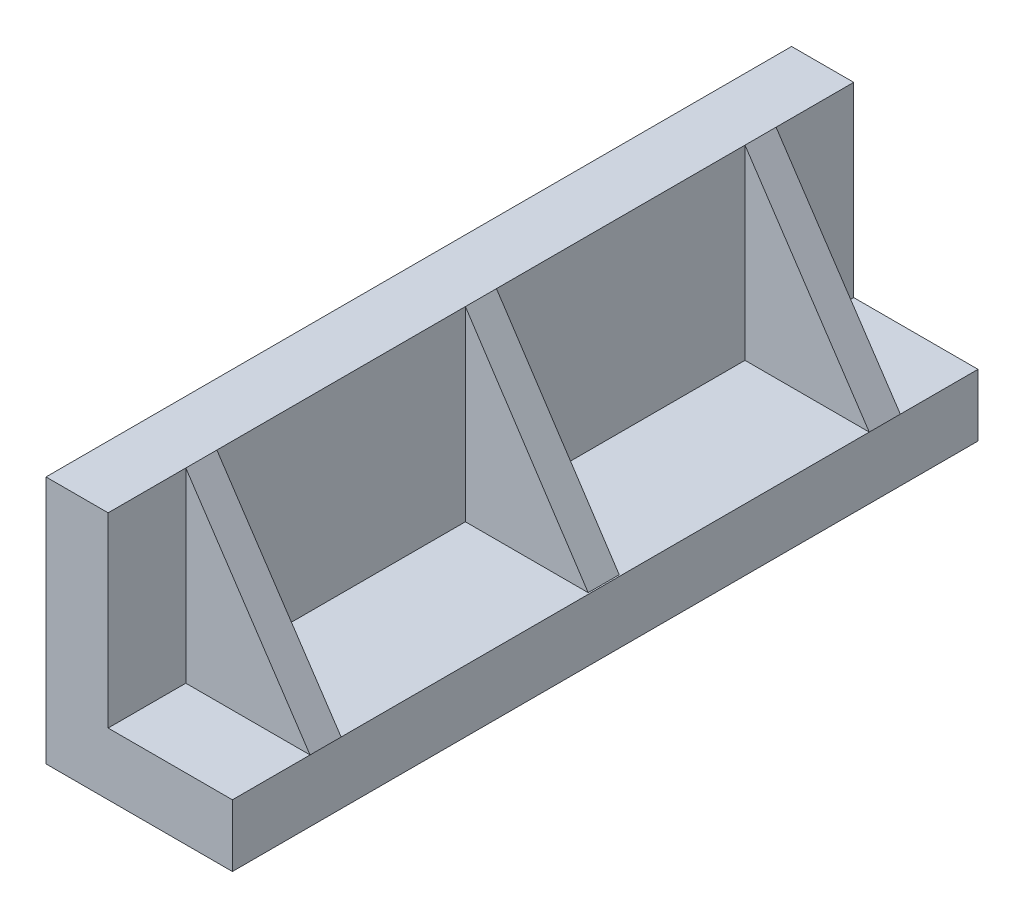
ISO-10303-21;
HEADER;
FILE_DESCRIPTION(('STEP AP214'),'2;1');
FILE_NAME('part.step','',(''),(''),'','','');
FILE_SCHEMA(('AUTOMOTIVE_DESIGN { 1 0 10303 214 1 1 1 1 }'));
ENDSEC;
DATA;
#1=APPLICATION_CONTEXT('core data for automotive mechanical design processes');
#2=APPLICATION_PROTOCOL_DEFINITION('international standard','automotive_design',2000,#1);
#3=PRODUCT_CONTEXT('',#1,'mechanical');
#4=PRODUCT('Part','Part','',(#3));
#5=PRODUCT_RELATED_PRODUCT_CATEGORY('part','',(#4));
#6=PRODUCT_DEFINITION_FORMATION('','',#4);
#7=PRODUCT_DEFINITION_CONTEXT('part definition',#1,'design');
#8=PRODUCT_DEFINITION('design','',#6,#7);
#9=PRODUCT_DEFINITION_SHAPE('','',#8);
#10=(LENGTH_UNIT() NAMED_UNIT(*) SI_UNIT(.MILLI.,.METRE.));
#11=(NAMED_UNIT(*) PLANE_ANGLE_UNIT() SI_UNIT($,.RADIAN.));
#12=(NAMED_UNIT(*) SI_UNIT($,.STERADIAN.) SOLID_ANGLE_UNIT());
#13=UNCERTAINTY_MEASURE_WITH_UNIT(LENGTH_MEASURE(1.E-05),#10,'distance_accuracy_value','');
#14=(GEOMETRIC_REPRESENTATION_CONTEXT(3) GLOBAL_UNCERTAINTY_ASSIGNED_CONTEXT((#13)) GLOBAL_UNIT_ASSIGNED_CONTEXT((#10,
#11,#12)) REPRESENTATION_CONTEXT('',''));
#15=CARTESIAN_POINT('',(0.,0.,0.));
#16=DIRECTION('',(0.,0.,1.));
#17=DIRECTION('',(1.,0.,0.));
#18=AXIS2_PLACEMENT_3D('',#15,#16,#17);
#19=CARTESIAN_POINT('',(30.,10.,120.));
#20=DIRECTION('',(0.,-1.,0.));
#21=DIRECTION('',(1.,0.,0.));
#22=AXIS2_PLACEMENT_3D('',#19,#20,#21);
#23=PLANE('',#22);
#24=DIRECTION('',(-1.,0.,0.));
#25=VECTOR('',#24,1.);
#26=CARTESIAN_POINT('',(30.,10.,12.5));
#27=LINE('',#26,#25);
#28=CARTESIAN_POINT('',(30.,10.,12.5));
#29=VERTEX_POINT('',#28);
#30=CARTESIAN_POINT('',(10.,10.,12.5));
#31=VERTEX_POINT('',#30);
#32=EDGE_CURVE('E163',#29,#31,#27,.T.);
#33=ORIENTED_EDGE('',*,*,#32,.F.);
#34=DIRECTION('',(0.,0.,-1.));
#35=VECTOR('',#34,1.);
#36=CARTESIAN_POINT('',(30.,10.,120.));
#37=LINE('',#36,#35);
#38=CARTESIAN_POINT('',(30.,10.,0.));
#39=VERTEX_POINT('',#38);
#40=EDGE_CURVE('E147',#29,#39,#37,.T.);
#41=ORIENTED_EDGE('',*,*,#40,.T.);
#42=DIRECTION('',(-1.,0.,0.));
#43=VECTOR('',#42,1.);
#44=CARTESIAN_POINT('',(30.,10.,0.));
#45=LINE('',#44,#43);
#46=CARTESIAN_POINT('',(10.,10.,0.));
#47=VERTEX_POINT('',#46);
#48=EDGE_CURVE('E267',#39,#47,#45,.T.);
#49=ORIENTED_EDGE('',*,*,#48,.T.);
#50=DIRECTION('',(0.,0.,-1.));
#51=VECTOR('',#50,1.);
#52=CARTESIAN_POINT('',(10.,10.,120.));
#53=LINE('',#52,#51);
#54=EDGE_CURVE('E164',#31,#47,#53,.T.);
#55=ORIENTED_EDGE('',*,*,#54,.F.);
#56=EDGE_LOOP('',(#33,#41,#49,#55));
#57=FACE_BOUND('',#56,.T.);
#58=ADVANCED_FACE('F39',(#57),#23,.F.);
#59=CARTESIAN_POINT('',(10.,10.,120.));
#60=DIRECTION('',(-1.,0.,0.));
#61=DIRECTION('',(0.,-1.,0.));
#62=AXIS2_PLACEMENT_3D('',#59,#60,#61);
#63=PLANE('',#62);
#64=DIRECTION('',(0.,1.,0.));
#65=VECTOR('',#64,1.);
#66=CARTESIAN_POINT('',(10.,10.,12.5));
#67=LINE('',#66,#65);
#68=CARTESIAN_POINT('',(10.,40.,12.5));
#69=VERTEX_POINT('',#68);
#70=EDGE_CURVE('E55',#31,#69,#67,.T.);
#71=ORIENTED_EDGE('',*,*,#70,.F.);
#72=ORIENTED_EDGE('',*,*,#54,.T.);
#73=DIRECTION('',(0.,1.,0.));
#74=VECTOR('',#73,1.);
#75=CARTESIAN_POINT('',(10.,10.,0.));
#76=LINE('',#75,#74);
#77=CARTESIAN_POINT('',(10.,40.,0.));
#78=VERTEX_POINT('',#77);
#79=EDGE_CURVE('E238',#47,#78,#76,.T.);
#80=ORIENTED_EDGE('',*,*,#79,.T.);
#81=DIRECTION('',(0.,0.,-1.));
#82=VECTOR('',#81,1.);
#83=CARTESIAN_POINT('',(10.,40.,120.));
#84=LINE('',#83,#82);
#85=EDGE_CURVE('E253',#69,#78,#84,.T.);
#86=ORIENTED_EDGE('',*,*,#85,.F.);
#87=EDGE_LOOP('',(#71,#72,#80,#86));
#88=FACE_BOUND('',#87,.T.);
#89=ADVANCED_FACE('F346',(#88),#63,.F.);
#90=CARTESIAN_POINT('',(30.,10.,102.5));
#91=VERTEX_POINT('',#90);
#92=CARTESIAN_POINT('',(30.,10.,17.5));
#93=VERTEX_POINT('',#92);
#94=EDGE_CURVE('E179',#91,#93,#37,.T.);
#95=ORIENTED_EDGE('',*,*,#94,.T.);
#96=DIRECTION('',(-1.,0.,0.));
#97=VECTOR('',#96,1.);
#98=CARTESIAN_POINT('',(30.,10.,17.5));
#99=LINE('',#98,#97);
#100=CARTESIAN_POINT('',(10.,10.,17.5));
#101=VERTEX_POINT('',#100);
#102=EDGE_CURVE('E63',#93,#101,#99,.T.);
#103=ORIENTED_EDGE('',*,*,#102,.T.);
#104=CARTESIAN_POINT('',(10.,10.,57.5));
#105=VERTEX_POINT('',#104);
#106=EDGE_CURVE('E282',#105,#101,#53,.T.);
#107=ORIENTED_EDGE('',*,*,#106,.F.);
#108=DIRECTION('',(-1.,0.,0.));
#109=VECTOR('',#108,1.);
#110=CARTESIAN_POINT('',(30.,10.,57.5));
#111=LINE('',#110,#109);
#112=CARTESIAN_POINT('',(29.7588143238516,10.,57.5));
#113=VERTEX_POINT('',#112);
#114=EDGE_CURVE('E218',#113,#105,#111,.T.);
#115=ORIENTED_EDGE('',*,*,#114,.F.);
#116=DIRECTION('',(0.,0.,-1.));
#117=VECTOR('',#116,1.);
#118=CARTESIAN_POINT('',(29.7588143238516,10.,120.));
#119=LINE('',#118,#117);
#120=CARTESIAN_POINT('',(29.7588143238516,10.,62.5));
#121=VERTEX_POINT('',#120);
#122=EDGE_CURVE('E229',#113,#121,#119,.F.);
#123=ORIENTED_EDGE('',*,*,#122,.T.);
#124=DIRECTION('',(-1.,0.,0.));
#125=VECTOR('',#124,1.);
#126=CARTESIAN_POINT('',(30.,10.,62.5));
#127=LINE('',#126,#125);
#128=CARTESIAN_POINT('',(10.,10.,62.5));
#129=VERTEX_POINT('',#128);
#130=EDGE_CURVE('E225',#121,#129,#127,.T.);
#131=ORIENTED_EDGE('',*,*,#130,.T.);
#132=CARTESIAN_POINT('',(10.,10.,102.5));
#133=VERTEX_POINT('',#132);
#134=EDGE_CURVE('E281',#133,#129,#53,.T.);
#135=ORIENTED_EDGE('',*,*,#134,.F.);
#136=DIRECTION('',(-1.,0.,0.));
#137=VECTOR('',#136,1.);
#138=CARTESIAN_POINT('',(30.,10.,102.5));
#139=LINE('',#138,#137);
#140=EDGE_CURVE('E200',#91,#133,#139,.T.);
#141=ORIENTED_EDGE('',*,*,#140,.F.);
#142=EDGE_LOOP('',(#95,#103,#107,#115,#123,#131,#135,#141));
#143=FACE_BOUND('',#142,.T.);
#144=ADVANCED_FACE('F355',(#143),#23,.F.);
#145=DIRECTION('',(0.,1.,0.));
#146=VECTOR('',#145,1.);
#147=CARTESIAN_POINT('',(10.,10.,102.5));
#148=LINE('',#147,#146);
#149=CARTESIAN_POINT('',(10.,40.,102.5));
#150=VERTEX_POINT('',#149);
#151=EDGE_CURVE('E48',#133,#150,#148,.T.);
#152=ORIENTED_EDGE('',*,*,#151,.F.);
#153=ORIENTED_EDGE('',*,*,#134,.T.);
#154=DIRECTION('',(0.,1.,0.));
#155=VECTOR('',#154,1.);
#156=CARTESIAN_POINT('',(10.,10.,62.5));
#157=LINE('',#156,#155);
#158=CARTESIAN_POINT('',(10.,40.,62.5));
#159=VERTEX_POINT('',#158);
#160=EDGE_CURVE('E299',#129,#159,#157,.T.);
#161=ORIENTED_EDGE('',*,*,#160,.T.);
#162=EDGE_CURVE('E365',#150,#159,#84,.T.);
#163=ORIENTED_EDGE('',*,*,#162,.F.);
#164=EDGE_LOOP('',(#152,#153,#161,#163));
#165=FACE_BOUND('',#164,.T.);
#166=ADVANCED_FACE('F351',(#165),#63,.F.);
#167=ORIENTED_EDGE('',*,*,#106,.T.);
#168=DIRECTION('',(0.,1.,0.));
#169=VECTOR('',#168,1.);
#170=CARTESIAN_POINT('',(10.,10.,17.5));
#171=LINE('',#170,#169);
#172=CARTESIAN_POINT('',(10.,40.,17.5));
#173=VERTEX_POINT('',#172);
#174=EDGE_CURVE('E168',#101,#173,#171,.T.);
#175=ORIENTED_EDGE('',*,*,#174,.T.);
#176=CARTESIAN_POINT('',(10.,40.,57.5));
#177=VERTEX_POINT('',#176);
#178=EDGE_CURVE('E366',#177,#173,#84,.T.);
#179=ORIENTED_EDGE('',*,*,#178,.F.);
#180=DIRECTION('',(0.,1.,0.));
#181=VECTOR('',#180,1.);
#182=CARTESIAN_POINT('',(10.,10.,57.5));
#183=LINE('',#182,#181);
#184=EDGE_CURVE('E295',#105,#177,#183,.T.);
#185=ORIENTED_EDGE('',*,*,#184,.F.);
#186=EDGE_LOOP('',(#167,#175,#179,#185));
#187=FACE_BOUND('',#186,.T.);
#188=ADVANCED_FACE('F375',(#187),#63,.F.);
#189=CARTESIAN_POINT('',(10.,40.,120.));
#190=DIRECTION('',(0.,-1.,0.));
#191=DIRECTION('',(0.,0.,-1.));
#192=AXIS2_PLACEMENT_3D('',#189,#190,#191);
#193=PLANE('',#192);
#194=ORIENTED_EDGE('',*,*,#178,.T.);
#195=DIRECTION('',(0.,0.,-1.));
#196=VECTOR('',#195,1.);
#197=CARTESIAN_POINT('',(10.,40.,120.));
#198=LINE('',#197,#196);
#199=EDGE_CURVE('E192',#69,#173,#198,.F.);
#200=ORIENTED_EDGE('',*,*,#199,.F.);
#201=ORIENTED_EDGE('',*,*,#85,.T.);
#202=DIRECTION('',(-1.,0.,0.));
#203=VECTOR('',#202,1.);
#204=CARTESIAN_POINT('',(10.,40.,0.));
#205=LINE('',#204,#203);
#206=CARTESIAN_POINT('',(0.,40.,0.));
#207=VERTEX_POINT('',#206);
#208=EDGE_CURVE('E232',#78,#207,#205,.T.);
#209=ORIENTED_EDGE('',*,*,#208,.T.);
#210=DIRECTION('',(0.,0.,-1.));
#211=VECTOR('',#210,1.);
#212=CARTESIAN_POINT('',(0.,40.,120.));
#213=LINE('',#212,#211);
#214=CARTESIAN_POINT('',(0.,40.,120.));
#215=VERTEX_POINT('',#214);
#216=EDGE_CURVE('E292',#215,#207,#213,.T.);
#217=ORIENTED_EDGE('',*,*,#216,.F.);
#218=DIRECTION('',(-1.,0.,0.));
#219=VECTOR('',#218,1.);
#220=CARTESIAN_POINT('',(10.,40.,120.));
#221=LINE('',#220,#219);
#222=CARTESIAN_POINT('',(10.,40.,120.));
#223=VERTEX_POINT('',#222);
#224=EDGE_CURVE('E233',#223,#215,#221,.T.);
#225=ORIENTED_EDGE('',*,*,#224,.F.);
#226=CARTESIAN_POINT('',(10.,40.,107.5));
#227=VERTEX_POINT('',#226);
#228=EDGE_CURVE('E273',#223,#227,#84,.T.);
#229=ORIENTED_EDGE('',*,*,#228,.T.);
#230=EDGE_CURVE('E277',#227,#150,#84,.T.);
#231=ORIENTED_EDGE('',*,*,#230,.T.);
#232=ORIENTED_EDGE('',*,*,#162,.T.);
#233=EDGE_CURVE('E278',#159,#177,#84,.T.);
#234=ORIENTED_EDGE('',*,*,#233,.T.);
#235=EDGE_LOOP('',(#194,#200,#201,#209,#217,#225,#229,#231,#232,#234));
#236=FACE_BOUND('',#235,.T.);
#237=ADVANCED_FACE('F41',(#236),#193,.F.);
#238=CARTESIAN_POINT('',(0.,40.,120.));
#239=DIRECTION('',(1.,0.,0.));
#240=DIRECTION('',(0.,1.,0.));
#241=AXIS2_PLACEMENT_3D('',#238,#239,#240);
#242=PLANE('',#241);
#243=ORIENTED_EDGE('',*,*,#216,.T.);
#244=DIRECTION('',(0.,-1.,0.));
#245=VECTOR('',#244,1.);
#246=CARTESIAN_POINT('',(0.,40.,0.));
#247=LINE('',#246,#245);
#248=CARTESIAN_POINT('',(0.,0.,0.));
#249=VERTEX_POINT('',#248);
#250=EDGE_CURVE('E257',#207,#249,#247,.T.);
#251=ORIENTED_EDGE('',*,*,#250,.T.);
#252=DIRECTION('',(0.,0.,-1.));
#253=VECTOR('',#252,1.);
#254=CARTESIAN_POINT('',(0.,0.,120.));
#255=LINE('',#254,#253);
#256=CARTESIAN_POINT('',(0.,0.,120.));
#257=VERTEX_POINT('',#256);
#258=EDGE_CURVE('E289',#257,#249,#255,.T.);
#259=ORIENTED_EDGE('',*,*,#258,.F.);
#260=DIRECTION('',(0.,-1.,0.));
#261=VECTOR('',#260,1.);
#262=CARTESIAN_POINT('',(0.,40.,120.));
#263=LINE('',#262,#261);
#264=EDGE_CURVE('E237',#215,#257,#263,.T.);
#265=ORIENTED_EDGE('',*,*,#264,.F.);
#266=EDGE_LOOP('',(#243,#251,#259,#265));
#267=FACE_BOUND('',#266,.T.);
#268=ADVANCED_FACE('F403',(#267),#242,.F.);
#269=CARTESIAN_POINT('',(0.,0.,120.));
#270=DIRECTION('',(0.,1.,0.));
#271=DIRECTION('',(0.,0.,1.));
#272=AXIS2_PLACEMENT_3D('',#269,#270,#271);
#273=PLANE('',#272);
#274=ORIENTED_EDGE('',*,*,#258,.T.);
#275=DIRECTION('',(1.,0.,0.));
#276=VECTOR('',#275,1.);
#277=CARTESIAN_POINT('',(0.,0.,0.));
#278=LINE('',#277,#276);
#279=CARTESIAN_POINT('',(30.,0.,0.));
#280=VERTEX_POINT('',#279);
#281=EDGE_CURVE('E261',#249,#280,#278,.T.);
#282=ORIENTED_EDGE('',*,*,#281,.T.);
#283=DIRECTION('',(0.,0.,-1.));
#284=VECTOR('',#283,1.);
#285=CARTESIAN_POINT('',(30.,0.,120.));
#286=LINE('',#285,#284);
#287=CARTESIAN_POINT('',(30.,0.,120.));
#288=VERTEX_POINT('',#287);
#289=EDGE_CURVE('E286',#288,#280,#286,.T.);
#290=ORIENTED_EDGE('',*,*,#289,.F.);
#291=DIRECTION('',(1.,0.,0.));
#292=VECTOR('',#291,1.);
#293=CARTESIAN_POINT('',(0.,0.,120.));
#294=LINE('',#293,#292);
#295=EDGE_CURVE('E241',#257,#288,#294,.T.);
#296=ORIENTED_EDGE('',*,*,#295,.F.);
#297=EDGE_LOOP('',(#274,#282,#290,#296));
#298=FACE_BOUND('',#297,.T.);
#299=ADVANCED_FACE('F340',(#298),#273,.F.);
#300=CARTESIAN_POINT('',(30.,0.,120.));
#301=DIRECTION('',(-1.,0.,0.));
#302=DIRECTION('',(0.,0.,1.));
#303=AXIS2_PLACEMENT_3D('',#300,#301,#302);
#304=PLANE('',#303);
#305=ORIENTED_EDGE('',*,*,#289,.T.);
#306=DIRECTION('',(0.,1.,0.));
#307=VECTOR('',#306,1.);
#308=CARTESIAN_POINT('',(30.,0.,0.));
#309=LINE('',#308,#307);
#310=EDGE_CURVE('E154',#280,#39,#309,.T.);
#311=ORIENTED_EDGE('',*,*,#310,.T.);
#312=ORIENTED_EDGE('',*,*,#40,.F.);
#313=EDGE_CURVE('E152',#93,#29,#37,.T.);
#314=ORIENTED_EDGE('',*,*,#313,.F.);
#315=ORIENTED_EDGE('',*,*,#94,.F.);
#316=DIRECTION('',(0.,0.,-1.));
#317=VECTOR('',#316,1.);
#318=CARTESIAN_POINT('',(30.,10.,120.));
#319=LINE('',#318,#317);
#320=CARTESIAN_POINT('',(30.,10.,107.5));
#321=VERTEX_POINT('',#320);
#322=EDGE_CURVE('E210',#91,#321,#319,.F.);
#323=ORIENTED_EDGE('',*,*,#322,.T.);
#324=CARTESIAN_POINT('',(30.,10.,120.));
#325=VERTEX_POINT('',#324);
#326=EDGE_CURVE('E161',#325,#321,#37,.T.);
#327=ORIENTED_EDGE('',*,*,#326,.F.);
#328=DIRECTION('',(0.,1.,0.));
#329=VECTOR('',#328,1.);
#330=CARTESIAN_POINT('',(30.,0.,120.));
#331=LINE('',#330,#329);
#332=EDGE_CURVE('E244',#288,#325,#331,.T.);
#333=ORIENTED_EDGE('',*,*,#332,.F.);
#334=EDGE_LOOP('',(#305,#311,#312,#314,#315,#323,#327,#333));
#335=FACE_BOUND('',#334,.T.);
#336=ADVANCED_FACE('F149',(#335),#304,.F.);
#337=ORIENTED_EDGE('',*,*,#326,.T.);
#338=DIRECTION('',(-1.,0.,0.));
#339=VECTOR('',#338,1.);
#340=CARTESIAN_POINT('',(30.,10.,107.5));
#341=LINE('',#340,#339);
#342=CARTESIAN_POINT('',(10.,10.,107.5));
#343=VERTEX_POINT('',#342);
#344=EDGE_CURVE('E207',#321,#343,#341,.T.);
#345=ORIENTED_EDGE('',*,*,#344,.T.);
#346=CARTESIAN_POINT('',(10.,10.,120.));
#347=VERTEX_POINT('',#346);
#348=EDGE_CURVE('E159',#347,#343,#53,.T.);
#349=ORIENTED_EDGE('',*,*,#348,.F.);
#350=DIRECTION('',(-1.,0.,0.));
#351=VECTOR('',#350,1.);
#352=CARTESIAN_POINT('',(30.,10.,120.));
#353=LINE('',#352,#351);
#354=EDGE_CURVE('E247',#325,#347,#353,.T.);
#355=ORIENTED_EDGE('',*,*,#354,.F.);
#356=EDGE_LOOP('',(#337,#345,#349,#355));
#357=FACE_BOUND('',#356,.T.);
#358=ADVANCED_FACE('F320',(#357),#23,.F.);
#359=ORIENTED_EDGE('',*,*,#348,.T.);
#360=DIRECTION('',(0.,1.,0.));
#361=VECTOR('',#360,1.);
#362=CARTESIAN_POINT('',(10.,10.,107.5));
#363=LINE('',#362,#361);
#364=EDGE_CURVE('E11',#343,#227,#363,.T.);
#365=ORIENTED_EDGE('',*,*,#364,.T.);
#366=ORIENTED_EDGE('',*,*,#228,.F.);
#367=DIRECTION('',(0.,1.,0.));
#368=VECTOR('',#367,1.);
#369=CARTESIAN_POINT('',(10.,10.,120.));
#370=LINE('',#369,#368);
#371=EDGE_CURVE('E250',#347,#223,#370,.T.);
#372=ORIENTED_EDGE('',*,*,#371,.F.);
#373=EDGE_LOOP('',(#359,#365,#366,#372));
#374=FACE_BOUND('',#373,.T.);
#375=ADVANCED_FACE('F327',(#374),#63,.F.);
#376=CARTESIAN_POINT('',(0.,0.,120.));
#377=DIRECTION('',(0.,0.,1.));
#378=DIRECTION('',(1.,0.,0.));
#379=AXIS2_PLACEMENT_3D('',#376,#377,#378);
#380=PLANE('',#379);
#381=ORIENTED_EDGE('',*,*,#224,.T.);
#382=ORIENTED_EDGE('',*,*,#264,.T.);
#383=ORIENTED_EDGE('',*,*,#295,.T.);
#384=ORIENTED_EDGE('',*,*,#332,.T.);
#385=ORIENTED_EDGE('',*,*,#354,.T.);
#386=ORIENTED_EDGE('',*,*,#371,.T.);
#387=EDGE_LOOP('',(#381,#382,#383,#384,#385,#386));
#388=FACE_BOUND('',#387,.T.);
#389=ADVANCED_FACE('F334',(#388),#380,.T.);
#390=CARTESIAN_POINT('',(0.,0.,0.));
#391=DIRECTION('',(0.,0.,1.));
#392=DIRECTION('',(1.,0.,0.));
#393=AXIS2_PLACEMENT_3D('',#390,#391,#392);
#394=PLANE('',#393);
#395=ORIENTED_EDGE('',*,*,#208,.F.);
#396=ORIENTED_EDGE('',*,*,#79,.F.);
#397=ORIENTED_EDGE('',*,*,#48,.F.);
#398=ORIENTED_EDGE('',*,*,#310,.F.);
#399=ORIENTED_EDGE('',*,*,#281,.F.);
#400=ORIENTED_EDGE('',*,*,#250,.F.);
#401=EDGE_LOOP('',(#395,#396,#397,#398,#399,#400));
#402=FACE_BOUND('',#401,.T.);
#403=ADVANCED_FACE('F344',(#402),#394,.F.);
#404=CARTESIAN_POINT('',(10.,40.,60.));
#405=DIRECTION('',(-0.835136124072732,-0.550043320356474,0.));
#406=DIRECTION('',(0.550043320356474,-0.835136124072732,0.));
#407=AXIS2_PLACEMENT_3D('',#404,#405,#406);
#408=PLANE('',#407);
#409=ORIENTED_EDGE('',*,*,#122,.F.);
#410=DIRECTION('',(0.550043320356474,-0.835136124072732,0.));
#411=VECTOR('',#410,1.);
#412=CARTESIAN_POINT('',(10.,40.,57.5));
#413=LINE('',#412,#411);
#414=EDGE_CURVE('E213',#177,#113,#413,.T.);
#415=ORIENTED_EDGE('',*,*,#414,.F.);
#416=ORIENTED_EDGE('',*,*,#233,.F.);
#417=DIRECTION('',(0.550043320356474,-0.835136124072732,0.));
#418=VECTOR('',#417,1.);
#419=CARTESIAN_POINT('',(10.,40.,62.5));
#420=LINE('',#419,#418);
#421=EDGE_CURVE('E214',#159,#121,#420,.T.);
#422=ORIENTED_EDGE('',*,*,#421,.T.);
#423=EDGE_LOOP('',(#409,#415,#416,#422));
#424=FACE_BOUND('',#423,.T.);
#425=ADVANCED_FACE('F361',(#424),#408,.F.);
#426=CARTESIAN_POINT('',(15.,20.,62.5));
#427=DIRECTION('',(0.,0.,1.));
#428=DIRECTION('',(1.,0.,0.));
#429=AXIS2_PLACEMENT_3D('',#426,#427,#428);
#430=PLANE('',#429);
#431=ORIENTED_EDGE('',*,*,#130,.F.);
#432=ORIENTED_EDGE('',*,*,#421,.F.);
#433=ORIENTED_EDGE('',*,*,#160,.F.);
#434=EDGE_LOOP('',(#431,#432,#433));
#435=FACE_BOUND('',#434,.T.);
#436=ADVANCED_FACE('F359',(#435),#430,.T.);
#437=CARTESIAN_POINT('',(15.,20.,57.5));
#438=DIRECTION('',(0.,0.,1.));
#439=DIRECTION('',(1.,0.,0.));
#440=AXIS2_PLACEMENT_3D('',#437,#438,#439);
#441=PLANE('',#440);
#442=ORIENTED_EDGE('',*,*,#414,.T.);
#443=ORIENTED_EDGE('',*,*,#114,.T.);
#444=ORIENTED_EDGE('',*,*,#184,.T.);
#445=EDGE_LOOP('',(#442,#443,#444));
#446=FACE_BOUND('',#445,.T.);
#447=ADVANCED_FACE('F377',(#446),#441,.F.);
#448=CARTESIAN_POINT('',(10.,40.,105.));
#449=DIRECTION('',(-0.832050294337844,-0.554700196225229,0.));
#450=DIRECTION('',(0.554700196225229,-0.832050294337844,0.));
#451=AXIS2_PLACEMENT_3D('',#448,#449,#450);
#452=PLANE('',#451);
#453=ORIENTED_EDGE('',*,*,#322,.F.);
#454=DIRECTION('',(0.554700196225229,-0.832050294337844,0.));
#455=VECTOR('',#454,1.);
#456=CARTESIAN_POINT('',(10.,40.,102.5));
#457=LINE('',#456,#455);
#458=EDGE_CURVE('E195',#150,#91,#457,.T.);
#459=ORIENTED_EDGE('',*,*,#458,.F.);
#460=ORIENTED_EDGE('',*,*,#230,.F.);
#461=DIRECTION('',(0.554700196225229,-0.832050294337844,0.));
#462=VECTOR('',#461,1.);
#463=CARTESIAN_POINT('',(10.,40.,107.5));
#464=LINE('',#463,#462);
#465=EDGE_CURVE('E196',#227,#321,#464,.T.);
#466=ORIENTED_EDGE('',*,*,#465,.T.);
#467=EDGE_LOOP('',(#453,#459,#460,#466));
#468=FACE_BOUND('',#467,.T.);
#469=ADVANCED_FACE('F313',(#468),#452,.F.);
#470=CARTESIAN_POINT('',(15.,20.,107.5));
#471=DIRECTION('',(0.,0.,1.));
#472=DIRECTION('',(1.,0.,0.));
#473=AXIS2_PLACEMENT_3D('',#470,#471,#472);
#474=PLANE('',#473);
#475=ORIENTED_EDGE('',*,*,#344,.F.);
#476=ORIENTED_EDGE('',*,*,#465,.F.);
#477=ORIENTED_EDGE('',*,*,#364,.F.);
#478=EDGE_LOOP('',(#475,#476,#477));
#479=FACE_BOUND('',#478,.T.);
#480=ADVANCED_FACE('F324',(#479),#474,.T.);
#481=CARTESIAN_POINT('',(15.,20.,102.5));
#482=DIRECTION('',(0.,0.,1.));
#483=DIRECTION('',(1.,0.,0.));
#484=AXIS2_PLACEMENT_3D('',#481,#482,#483);
#485=PLANE('',#484);
#486=ORIENTED_EDGE('',*,*,#458,.T.);
#487=ORIENTED_EDGE('',*,*,#140,.T.);
#488=ORIENTED_EDGE('',*,*,#151,.T.);
#489=EDGE_LOOP('',(#486,#487,#488));
#490=FACE_BOUND('',#489,.T.);
#491=ADVANCED_FACE('F306',(#490),#485,.F.);
#492=CARTESIAN_POINT('',(15.,20.,17.5));
#493=DIRECTION('',(0.,0.,1.));
#494=DIRECTION('',(1.,0.,0.));
#495=AXIS2_PLACEMENT_3D('',#492,#493,#494);
#496=PLANE('',#495);
#497=ORIENTED_EDGE('',*,*,#102,.F.);
#498=DIRECTION('',(0.554700196225229,-0.832050294337844,0.));
#499=VECTOR('',#498,1.);
#500=CARTESIAN_POINT('',(10.,40.,17.5));
#501=LINE('',#500,#499);
#502=EDGE_CURVE('E177',#173,#93,#501,.T.);
#503=ORIENTED_EDGE('',*,*,#502,.F.);
#504=ORIENTED_EDGE('',*,*,#174,.F.);
#505=EDGE_LOOP('',(#497,#503,#504));
#506=FACE_BOUND('',#505,.T.);
#507=ADVANCED_FACE('F373',(#506),#496,.T.);
#508=CARTESIAN_POINT('',(15.,20.,12.5));
#509=DIRECTION('',(0.,0.,1.));
#510=DIRECTION('',(1.,0.,0.));
#511=AXIS2_PLACEMENT_3D('',#508,#509,#510);
#512=PLANE('',#511);
#513=DIRECTION('',(0.554700196225229,-0.832050294337844,0.));
#514=VECTOR('',#513,1.);
#515=CARTESIAN_POINT('',(10.,40.,12.5));
#516=LINE('',#515,#514);
#517=EDGE_CURVE('E175',#69,#29,#516,.T.);
#518=ORIENTED_EDGE('',*,*,#517,.T.);
#519=ORIENTED_EDGE('',*,*,#32,.T.);
#520=ORIENTED_EDGE('',*,*,#70,.T.);
#521=EDGE_LOOP('',(#518,#519,#520));
#522=FACE_BOUND('',#521,.T.);
#523=ADVANCED_FACE('F180',(#522),#512,.F.);
#524=CARTESIAN_POINT('',(10.,40.,15.));
#525=DIRECTION('',(-0.832050294337844,-0.554700196225229,0.));
#526=DIRECTION('',(0.554700196225229,-0.832050294337844,0.));
#527=AXIS2_PLACEMENT_3D('',#524,#525,#526);
#528=PLANE('',#527);
#529=ORIENTED_EDGE('',*,*,#517,.F.);
#530=ORIENTED_EDGE('',*,*,#199,.T.);
#531=ORIENTED_EDGE('',*,*,#502,.T.);
#532=ORIENTED_EDGE('',*,*,#313,.T.);
#533=EDGE_LOOP('',(#529,#530,#531,#532));
#534=FACE_BOUND('',#533,.T.);
#535=ADVANCED_FACE('F173',(#534),#528,.F.);
#536=CLOSED_SHELL('',(#58,#89,#144,#166,#188,#237,#268,#299,#336,#358,#375,#389,#403,#425,#436,
#447,#469,#480,#491,#507,#523,#535));
#537=MANIFOLD_SOLID_BREP('B2',#536);
#538=ADVANCED_BREP_SHAPE_REPRESENTATION('',(#18,#537),#14);
#539=SHAPE_DEFINITION_REPRESENTATION(#9,#538);
ENDSEC;
END-ISO-10303-21;
